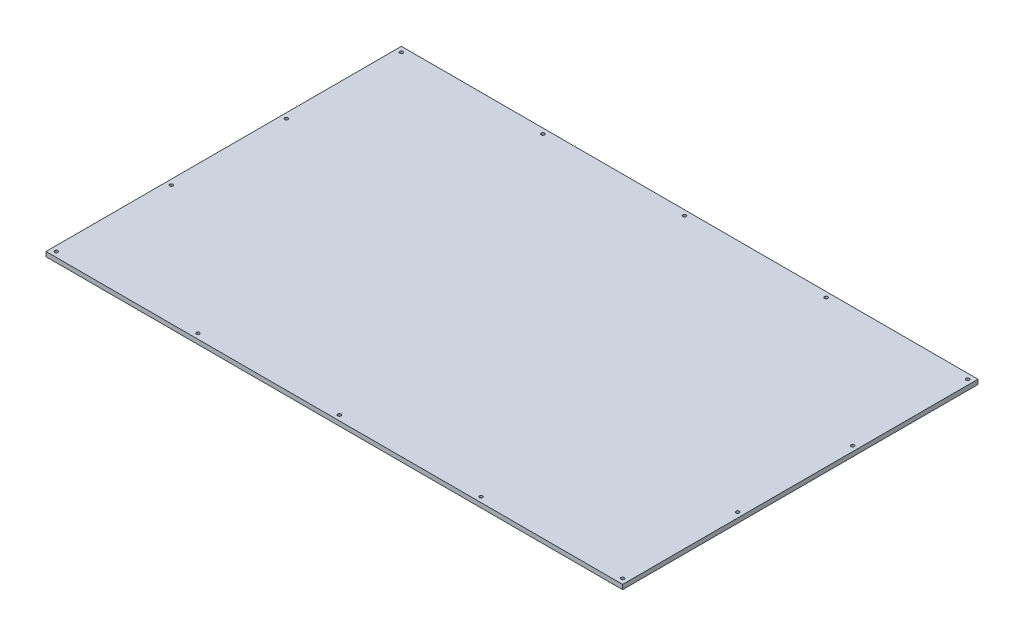
ISO-10303-21;
HEADER;
FILE_DESCRIPTION(('STEP AP214'),'2;1');
FILE_NAME('part.step','',(''),(''),'','','');
FILE_SCHEMA(('AUTOMOTIVE_DESIGN { 1 0 10303 214 1 1 1 1 }'));
ENDSEC;
DATA;
#1=APPLICATION_CONTEXT('core data for automotive mechanical design processes');
#2=APPLICATION_PROTOCOL_DEFINITION('international standard','automotive_design',2000,#1);
#3=PRODUCT_CONTEXT('',#1,'mechanical');
#4=PRODUCT('Part','Part','',(#3));
#5=PRODUCT_RELATED_PRODUCT_CATEGORY('part','',(#4));
#6=PRODUCT_DEFINITION_FORMATION('','',#4);
#7=PRODUCT_DEFINITION_CONTEXT('part definition',#1,'design');
#8=PRODUCT_DEFINITION('design','',#6,#7);
#9=PRODUCT_DEFINITION_SHAPE('','',#8);
#10=(LENGTH_UNIT() NAMED_UNIT(*) SI_UNIT(.MILLI.,.METRE.));
#11=(NAMED_UNIT(*) PLANE_ANGLE_UNIT() SI_UNIT($,.RADIAN.));
#12=(NAMED_UNIT(*) SI_UNIT($,.STERADIAN.) SOLID_ANGLE_UNIT());
#13=UNCERTAINTY_MEASURE_WITH_UNIT(LENGTH_MEASURE(1.E-05),#10,'distance_accuracy_value','');
#14=(GEOMETRIC_REPRESENTATION_CONTEXT(3) GLOBAL_UNCERTAINTY_ASSIGNED_CONTEXT((#13)) GLOBAL_UNIT_ASSIGNED_CONTEXT((#10,
#11,#12)) REPRESENTATION_CONTEXT('',''));
#15=CARTESIAN_POINT('',(0.,0.,0.));
#16=DIRECTION('',(0.,0.,1.));
#17=DIRECTION('',(1.,0.,0.));
#18=AXIS2_PLACEMENT_3D('',#15,#16,#17);
#19=CARTESIAN_POINT('',(3.07732182242956E-13,4.445,0.));
#20=DIRECTION('',(0.,1.,0.));
#21=DIRECTION('',(0.,0.,-1.));
#22=AXIS2_PLACEMENT_3D('',#19,#20,#21);
#23=PLANE('',#22);
#24=DIRECTION('',(0.,0.,-1.));
#25=VECTOR('',#24,1.);
#26=CARTESIAN_POINT('',(-399.256249999999,4.44499999999721,246.0625));
#27=LINE('',#26,#25);
#28=CARTESIAN_POINT('',(-399.256249999999,4.44499999999721,246.0625));
#29=VERTEX_POINT('',#28);
#30=CARTESIAN_POINT('',(-399.256249999999,4.44499999999721,-246.0625));
#31=VERTEX_POINT('',#30);
#32=EDGE_CURVE('E86',#29,#31,#27,.T.);
#33=ORIENTED_EDGE('',*,*,#32,.T.);
#34=DIRECTION('',(1.,0.,0.));
#35=VECTOR('',#34,1.);
#36=CARTESIAN_POINT('',(399.25625,4.44500000000279,-246.0625));
#37=LINE('',#36,#35);
#38=CARTESIAN_POINT('',(399.25625,4.44500000000279,-246.0625));
#39=VERTEX_POINT('',#38);
#40=EDGE_CURVE('E81',#31,#39,#37,.T.);
#41=ORIENTED_EDGE('',*,*,#40,.T.);
#42=DIRECTION('',(0.,0.,1.));
#43=VECTOR('',#42,1.);
#44=CARTESIAN_POINT('',(399.25625,4.44500000000279,246.0625));
#45=LINE('',#44,#43);
#46=CARTESIAN_POINT('',(399.25625,4.44500000000279,246.0625));
#47=VERTEX_POINT('',#46);
#48=EDGE_CURVE('E84',#39,#47,#45,.T.);
#49=ORIENTED_EDGE('',*,*,#48,.T.);
#50=DIRECTION('',(-1.,0.,0.));
#51=VECTOR('',#50,1.);
#52=CARTESIAN_POINT('',(399.25625,4.44500000000279,246.0625));
#53=LINE('',#52,#51);
#54=EDGE_CURVE('E51',#47,#29,#53,.T.);
#55=ORIENTED_EDGE('',*,*,#54,.T.);
#56=EDGE_LOOP('',(#33,#41,#49,#55));
#57=FACE_BOUND('',#56,.T.);
#58=CARTESIAN_POINT('',(196.056250000002,4.44500000000137,238.918749999995));
#59=DIRECTION('',(0.,-1.,0.));
#60=DIRECTION('',(0.,0.,1.));
#61=AXIS2_PLACEMENT_3D('',#58,#59,#60);
#62=CIRCLE('',#61,4.21640000000001);
#63=CARTESIAN_POINT('',(196.056250000002,4.44500000000137,243.135149999995));
#64=VERTEX_POINT('',#63);
#65=EDGE_CURVE('E114',#64,#64,#62,.T.);
#66=ORIENTED_EDGE('',*,*,#65,.F.);
#67=EDGE_LOOP('',(#66));
#68=FACE_BOUND('',#67,.T.);
#69=CARTESIAN_POINT('',(2.25062247533698E-12,4.445,238.918749999997));
#70=DIRECTION('',(0.,-1.,0.));
#71=DIRECTION('',(0.,0.,1.));
#72=AXIS2_PLACEMENT_3D('',#69,#70,#71);
#73=CIRCLE('',#72,4.2164);
#74=CARTESIAN_POINT('',(2.25062247533698E-12,4.445,243.135149999997));
#75=VERTEX_POINT('',#74);
#76=EDGE_CURVE('E119',#75,#75,#73,.T.);
#77=ORIENTED_EDGE('',*,*,#76,.F.);
#78=EDGE_LOOP('',(#77));
#79=FACE_BOUND('',#78,.T.);
#80=CARTESIAN_POINT('',(-196.056249999998,4.44499999999863,238.918749999998));
#81=DIRECTION('',(0.,-1.,0.));
#82=DIRECTION('',(0.,0.,1.));
#83=AXIS2_PLACEMENT_3D('',#80,#81,#82);
#84=CIRCLE('',#83,4.21640000000001);
#85=CARTESIAN_POINT('',(-196.056249999998,4.44499999999863,243.135149999999));
#86=VERTEX_POINT('',#85);
#87=EDGE_CURVE('E124',#86,#86,#84,.T.);
#88=ORIENTED_EDGE('',*,*,#87,.F.);
#89=EDGE_LOOP('',(#88));
#90=FACE_BOUND('',#89,.T.);
#91=CARTESIAN_POINT('',(-392.1125,4.44499999999726,-79.6395833333332));
#92=DIRECTION('',(0.,-1.,0.));
#93=DIRECTION('',(0.,0.,1.));
#94=AXIS2_PLACEMENT_3D('',#91,#92,#93);
#95=CIRCLE('',#94,4.21640000000001);
#96=CARTESIAN_POINT('',(-392.1125,4.44499999999726,-75.4231833333332));
#97=VERTEX_POINT('',#96);
#98=EDGE_CURVE('E129',#97,#97,#95,.T.);
#99=ORIENTED_EDGE('',*,*,#98,.F.);
#100=EDGE_LOOP('',(#99));
#101=FACE_BOUND('',#100,.T.);
#102=CARTESIAN_POINT('',(-392.1125,4.44499999999726,79.6395833333335));
#103=DIRECTION('',(0.,-1.,0.));
#104=DIRECTION('',(0.,0.,1.));
#105=AXIS2_PLACEMENT_3D('',#102,#103,#104);
#106=CIRCLE('',#105,4.21640000000001);
#107=CARTESIAN_POINT('',(-392.1125,4.44499999999726,83.8559833333335));
#108=VERTEX_POINT('',#107);
#109=EDGE_CURVE('E134',#108,#108,#106,.T.);
#110=ORIENTED_EDGE('',*,*,#109,.F.);
#111=EDGE_LOOP('',(#110));
#112=FACE_BOUND('',#111,.T.);
#113=CARTESIAN_POINT('',(392.1125,4.44500000000274,79.6395833333335));
#114=DIRECTION('',(0.,-1.,0.));
#115=DIRECTION('',(0.,0.,1.));
#116=AXIS2_PLACEMENT_3D('',#113,#114,#115);
#117=CIRCLE('',#116,4.21640000000001);
#118=CARTESIAN_POINT('',(392.1125,4.44500000000274,83.8559833333335));
#119=VERTEX_POINT('',#118);
#120=EDGE_CURVE('E139',#119,#119,#117,.T.);
#121=ORIENTED_EDGE('',*,*,#120,.F.);
#122=EDGE_LOOP('',(#121));
#123=FACE_BOUND('',#122,.T.);
#124=CARTESIAN_POINT('',(392.1125,4.44500000000274,-79.6395833333332));
#125=DIRECTION('',(0.,-1.,0.));
#126=DIRECTION('',(0.,0.,1.));
#127=AXIS2_PLACEMENT_3D('',#124,#125,#126);
#128=CIRCLE('',#127,4.21640000000001);
#129=CARTESIAN_POINT('',(392.1125,4.44500000000274,-75.4231833333332));
#130=VERTEX_POINT('',#129);
#131=EDGE_CURVE('E144',#130,#130,#128,.T.);
#132=ORIENTED_EDGE('',*,*,#131,.F.);
#133=EDGE_LOOP('',(#132));
#134=FACE_BOUND('',#133,.T.);
#135=CARTESIAN_POINT('',(-196.056249999999,4.44499999999863,-238.91875));
#136=DIRECTION('',(0.,-1.,0.));
#137=DIRECTION('',(0.,0.,1.));
#138=AXIS2_PLACEMENT_3D('',#135,#136,#137);
#139=CIRCLE('',#138,4.21640000000001);
#140=CARTESIAN_POINT('',(-196.056249999999,4.44499999999863,-234.70235));
#141=VERTEX_POINT('',#140);
#142=EDGE_CURVE('E149',#141,#141,#139,.T.);
#143=ORIENTED_EDGE('',*,*,#142,.F.);
#144=EDGE_LOOP('',(#143));
#145=FACE_BOUND('',#144,.T.);
#146=CARTESIAN_POINT('',(196.05625,4.44500000000137,-238.91875));
#147=DIRECTION('',(0.,-1.,0.));
#148=DIRECTION('',(0.,0.,1.));
#149=AXIS2_PLACEMENT_3D('',#146,#147,#148);
#150=CIRCLE('',#149,4.21640000000001);
#151=CARTESIAN_POINT('',(196.05625,4.44500000000137,-234.70235));
#152=VERTEX_POINT('',#151);
#153=EDGE_CURVE('E154',#152,#152,#150,.T.);
#154=ORIENTED_EDGE('',*,*,#153,.F.);
#155=EDGE_LOOP('',(#154));
#156=FACE_BOUND('',#155,.T.);
#157=CARTESIAN_POINT('',(3.63243333474214E-13,4.445,-238.91875));
#158=DIRECTION('',(0.,-1.,0.));
#159=DIRECTION('',(0.,0.,1.));
#160=AXIS2_PLACEMENT_3D('',#157,#158,#159);
#161=CIRCLE('',#160,4.2164);
#162=CARTESIAN_POINT('',(3.63243333474214E-13,4.445,-234.70235));
#163=VERTEX_POINT('',#162);
#164=EDGE_CURVE('E159',#163,#163,#161,.T.);
#165=ORIENTED_EDGE('',*,*,#164,.F.);
#166=EDGE_LOOP('',(#165));
#167=FACE_BOUND('',#166,.T.);
#168=CARTESIAN_POINT('',(-392.1125,4.44499999999726,238.91875));
#169=DIRECTION('',(0.,-1.,0.));
#170=DIRECTION('',(0.,0.,1.));
#171=AXIS2_PLACEMENT_3D('',#168,#169,#170);
#172=CIRCLE('',#171,4.21640000000001);
#173=CARTESIAN_POINT('',(-392.1125,4.44499999999726,243.13515));
#174=VERTEX_POINT('',#173);
#175=EDGE_CURVE('E163',#174,#174,#172,.T.);
#176=ORIENTED_EDGE('',*,*,#175,.F.);
#177=EDGE_LOOP('',(#176));
#178=FACE_BOUND('',#177,.T.);
#179=CARTESIAN_POINT('',(392.1125,4.44500000000274,-238.91875));
#180=DIRECTION('',(0.,-1.,0.));
#181=DIRECTION('',(0.,0.,1.));
#182=AXIS2_PLACEMENT_3D('',#179,#180,#181);
#183=CIRCLE('',#182,4.21640000000001);
#184=CARTESIAN_POINT('',(392.1125,4.44500000000274,-234.70235));
#185=VERTEX_POINT('',#184);
#186=EDGE_CURVE('E167',#185,#185,#183,.T.);
#187=ORIENTED_EDGE('',*,*,#186,.F.);
#188=EDGE_LOOP('',(#187));
#189=FACE_BOUND('',#188,.T.);
#190=CARTESIAN_POINT('',(392.1125,4.44500000000274,238.91875));
#191=DIRECTION('',(0.,-1.,0.));
#192=DIRECTION('',(0.,0.,1.));
#193=AXIS2_PLACEMENT_3D('',#190,#191,#192);
#194=CIRCLE('',#193,4.21640000000001);
#195=CARTESIAN_POINT('',(392.1125,4.44500000000274,243.13515));
#196=VERTEX_POINT('',#195);
#197=EDGE_CURVE('E174',#196,#196,#194,.T.);
#198=ORIENTED_EDGE('',*,*,#197,.F.);
#199=EDGE_LOOP('',(#198));
#200=FACE_BOUND('',#199,.T.);
#201=CARTESIAN_POINT('',(-392.1125,4.44499999999726,-238.91875));
#202=DIRECTION('',(0.,-1.,0.));
#203=DIRECTION('',(0.,0.,1.));
#204=AXIS2_PLACEMENT_3D('',#201,#202,#203);
#205=CIRCLE('',#204,4.21640000000001);
#206=CARTESIAN_POINT('',(-392.1125,4.44499999999726,-234.70235));
#207=VERTEX_POINT('',#206);
#208=EDGE_CURVE('E266',#207,#207,#205,.T.);
#209=ORIENTED_EDGE('',*,*,#208,.F.);
#210=EDGE_LOOP('',(#209));
#211=FACE_BOUND('',#210,.T.);
#212=ADVANCED_FACE('F32',(#57,#68,#79,#90,#101,#112,#123,#134,#145,#156,#167,#178,#189,#200,
#211),#23,.F.);
#213=CARTESIAN_POINT('',(-399.256249999999,4.44499999999721,246.0625));
#214=DIRECTION('',(1.,0.,0.));
#215=DIRECTION('',(0.,0.,1.));
#216=AXIS2_PLACEMENT_3D('',#213,#214,#215);
#217=PLANE('',#216);
#218=DIRECTION('',(0.,0.,-1.));
#219=VECTOR('',#218,1.);
#220=CARTESIAN_POINT('',(-399.256249999999,10.7949999999972,246.0625));
#221=LINE('',#220,#219);
#222=CARTESIAN_POINT('',(-399.256249999999,10.7949999999972,246.0625));
#223=VERTEX_POINT('',#222);
#224=CARTESIAN_POINT('',(-399.256249999999,10.7949999999972,-246.0625));
#225=VERTEX_POINT('',#224);
#226=EDGE_CURVE('E99',#223,#225,#221,.T.);
#227=ORIENTED_EDGE('',*,*,#226,.T.);
#228=DIRECTION('',(0.,1.,0.));
#229=VECTOR('',#228,1.);
#230=CARTESIAN_POINT('',(-399.256249999999,4.44499999999721,-246.0625));
#231=LINE('',#230,#229);
#232=EDGE_CURVE('E11',#31,#225,#231,.T.);
#233=ORIENTED_EDGE('',*,*,#232,.F.);
#234=ORIENTED_EDGE('',*,*,#32,.F.);
#235=DIRECTION('',(0.,1.,0.));
#236=VECTOR('',#235,1.);
#237=CARTESIAN_POINT('',(-399.256249999999,4.44499999999721,246.0625));
#238=LINE('',#237,#236);
#239=EDGE_CURVE('E95',#29,#223,#238,.T.);
#240=ORIENTED_EDGE('',*,*,#239,.T.);
#241=EDGE_LOOP('',(#227,#233,#234,#240));
#242=FACE_BOUND('',#241,.T.);
#243=ADVANCED_FACE('F34',(#242),#217,.F.);
#244=CARTESIAN_POINT('',(399.25625,4.44500000000279,-246.0625));
#245=DIRECTION('',(0.,0.,1.));
#246=DIRECTION('',(-1.,0.,0.));
#247=AXIS2_PLACEMENT_3D('',#244,#245,#246);
#248=PLANE('',#247);
#249=DIRECTION('',(1.,0.,0.));
#250=VECTOR('',#249,1.);
#251=CARTESIAN_POINT('',(399.25625,10.7950000000028,-246.0625));
#252=LINE('',#251,#250);
#253=CARTESIAN_POINT('',(399.25625,10.7950000000028,-246.0625));
#254=VERTEX_POINT('',#253);
#255=EDGE_CURVE('E90',#225,#254,#252,.T.);
#256=ORIENTED_EDGE('',*,*,#255,.T.);
#257=DIRECTION('',(0.,1.,0.));
#258=VECTOR('',#257,1.);
#259=CARTESIAN_POINT('',(399.25625,4.44500000000279,-246.0625));
#260=LINE('',#259,#258);
#261=EDGE_CURVE('E42',#39,#254,#260,.T.);
#262=ORIENTED_EDGE('',*,*,#261,.F.);
#263=ORIENTED_EDGE('',*,*,#40,.F.);
#264=ORIENTED_EDGE('',*,*,#232,.T.);
#265=EDGE_LOOP('',(#256,#262,#263,#264));
#266=FACE_BOUND('',#265,.T.);
#267=ADVANCED_FACE('F89',(#266),#248,.F.);
#268=CARTESIAN_POINT('',(399.25625,4.44500000000279,246.0625));
#269=DIRECTION('',(-1.,0.,0.));
#270=DIRECTION('',(0.,0.,-1.));
#271=AXIS2_PLACEMENT_3D('',#268,#269,#270);
#272=PLANE('',#271);
#273=DIRECTION('',(0.,0.,1.));
#274=VECTOR('',#273,1.);
#275=CARTESIAN_POINT('',(399.25625,10.7950000000028,246.0625));
#276=LINE('',#275,#274);
#277=CARTESIAN_POINT('',(399.25625,10.7950000000028,246.0625));
#278=VERTEX_POINT('',#277);
#279=EDGE_CURVE('E68',#254,#278,#276,.T.);
#280=ORIENTED_EDGE('',*,*,#279,.T.);
#281=DIRECTION('',(0.,1.,0.));
#282=VECTOR('',#281,1.);
#283=CARTESIAN_POINT('',(399.25625,4.44500000000279,246.0625));
#284=LINE('',#283,#282);
#285=EDGE_CURVE('E91',#47,#278,#284,.T.);
#286=ORIENTED_EDGE('',*,*,#285,.F.);
#287=ORIENTED_EDGE('',*,*,#48,.F.);
#288=ORIENTED_EDGE('',*,*,#261,.T.);
#289=EDGE_LOOP('',(#280,#286,#287,#288));
#290=FACE_BOUND('',#289,.T.);
#291=ADVANCED_FACE('F93',(#290),#272,.F.);
#292=CARTESIAN_POINT('',(399.25625,4.44500000000279,246.0625));
#293=DIRECTION('',(0.,0.,-1.));
#294=DIRECTION('',(1.,0.,0.));
#295=AXIS2_PLACEMENT_3D('',#292,#293,#294);
#296=PLANE('',#295);
#297=DIRECTION('',(-1.,0.,0.));
#298=VECTOR('',#297,1.);
#299=CARTESIAN_POINT('',(399.25625,10.7950000000028,246.0625));
#300=LINE('',#299,#298);
#301=EDGE_CURVE('E74',#278,#223,#300,.T.);
#302=ORIENTED_EDGE('',*,*,#301,.T.);
#303=ORIENTED_EDGE('',*,*,#239,.F.);
#304=ORIENTED_EDGE('',*,*,#54,.F.);
#305=ORIENTED_EDGE('',*,*,#285,.T.);
#306=EDGE_LOOP('',(#302,#303,#304,#305));
#307=FACE_BOUND('',#306,.T.);
#308=ADVANCED_FACE('F281',(#307),#296,.F.);
#309=CARTESIAN_POINT('',(2.63390369239648E-13,10.795,0.));
#310=DIRECTION('',(0.,1.,0.));
#311=DIRECTION('',(0.,0.,-1.));
#312=AXIS2_PLACEMENT_3D('',#309,#310,#311);
#313=PLANE('',#312);
#314=CARTESIAN_POINT('',(-392.1125,10.7949999999973,-238.91875));
#315=DIRECTION('',(0.,1.,0.));
#316=DIRECTION('',(0.,0.,-1.));
#317=AXIS2_PLACEMENT_3D('',#314,#315,#316);
#318=CIRCLE('',#317,2.2479);
#319=CARTESIAN_POINT('',(-392.1125,10.7949999999973,-241.16665));
#320=VERTEX_POINT('',#319);
#321=EDGE_CURVE('E36',#320,#320,#318,.T.);
#322=ORIENTED_EDGE('',*,*,#321,.F.);
#323=EDGE_LOOP('',(#322));
#324=FACE_BOUND('',#323,.T.);
#325=CARTESIAN_POINT('',(392.1125,10.7950000000027,238.91875));
#326=DIRECTION('',(0.,1.,0.));
#327=DIRECTION('',(0.,0.,-1.));
#328=AXIS2_PLACEMENT_3D('',#325,#326,#327);
#329=CIRCLE('',#328,2.2479);
#330=CARTESIAN_POINT('',(392.1125,10.7950000000027,236.67085));
#331=VERTEX_POINT('',#330);
#332=EDGE_CURVE('E165',#331,#331,#329,.T.);
#333=ORIENTED_EDGE('',*,*,#332,.F.);
#334=EDGE_LOOP('',(#333));
#335=FACE_BOUND('',#334,.T.);
#336=CARTESIAN_POINT('',(392.1125,10.7950000000027,-238.91875));
#337=DIRECTION('',(0.,1.,0.));
#338=DIRECTION('',(0.,0.,-1.));
#339=AXIS2_PLACEMENT_3D('',#336,#337,#338);
#340=CIRCLE('',#339,2.2479);
#341=CARTESIAN_POINT('',(392.1125,10.7950000000027,-241.16665));
#342=VERTEX_POINT('',#341);
#343=EDGE_CURVE('E161',#342,#342,#340,.T.);
#344=ORIENTED_EDGE('',*,*,#343,.F.);
#345=EDGE_LOOP('',(#344));
#346=FACE_BOUND('',#345,.T.);
#347=CARTESIAN_POINT('',(-392.1125,10.7949999999973,238.91875));
#348=DIRECTION('',(0.,1.,0.));
#349=DIRECTION('',(0.,0.,-1.));
#350=AXIS2_PLACEMENT_3D('',#347,#348,#349);
#351=CIRCLE('',#350,2.2479);
#352=CARTESIAN_POINT('',(-392.1125,10.7949999999973,236.67085));
#353=VERTEX_POINT('',#352);
#354=EDGE_CURVE('E156',#353,#353,#351,.T.);
#355=ORIENTED_EDGE('',*,*,#354,.F.);
#356=EDGE_LOOP('',(#355));
#357=FACE_BOUND('',#356,.T.);
#358=CARTESIAN_POINT('',(3.18901520470906E-13,10.795,-238.91875));
#359=DIRECTION('',(0.,1.,0.));
#360=DIRECTION('',(0.,0.,-1.));
#361=AXIS2_PLACEMENT_3D('',#358,#359,#360);
#362=CIRCLE('',#361,2.2479);
#363=CARTESIAN_POINT('',(3.18901520470906E-13,10.795,-241.16665));
#364=VERTEX_POINT('',#363);
#365=EDGE_CURVE('E151',#364,#364,#362,.T.);
#366=ORIENTED_EDGE('',*,*,#365,.F.);
#367=EDGE_LOOP('',(#366));
#368=FACE_BOUND('',#367,.T.);
#369=CARTESIAN_POINT('',(196.05625,10.7950000000014,-238.91875));
#370=DIRECTION('',(0.,1.,0.));
#371=DIRECTION('',(0.,0.,-1.));
#372=AXIS2_PLACEMENT_3D('',#369,#370,#371);
#373=CIRCLE('',#372,2.2479);
#374=CARTESIAN_POINT('',(196.05625,10.7950000000014,-241.16665));
#375=VERTEX_POINT('',#374);
#376=EDGE_CURVE('E146',#375,#375,#373,.T.);
#377=ORIENTED_EDGE('',*,*,#376,.F.);
#378=EDGE_LOOP('',(#377));
#379=FACE_BOUND('',#378,.T.);
#380=CARTESIAN_POINT('',(-196.056249999999,10.7949999999986,-238.91875));
#381=DIRECTION('',(0.,1.,0.));
#382=DIRECTION('',(0.,0.,-1.));
#383=AXIS2_PLACEMENT_3D('',#380,#381,#382);
#384=CIRCLE('',#383,2.2479);
#385=CARTESIAN_POINT('',(-196.056249999999,10.7949999999986,-241.16665));
#386=VERTEX_POINT('',#385);
#387=EDGE_CURVE('E141',#386,#386,#384,.T.);
#388=ORIENTED_EDGE('',*,*,#387,.F.);
#389=EDGE_LOOP('',(#388));
#390=FACE_BOUND('',#389,.T.);
#391=CARTESIAN_POINT('',(392.1125,10.7950000000027,-79.6395833333332));
#392=DIRECTION('',(0.,1.,0.));
#393=DIRECTION('',(0.,0.,-1.));
#394=AXIS2_PLACEMENT_3D('',#391,#392,#393);
#395=CIRCLE('',#394,2.2479);
#396=CARTESIAN_POINT('',(392.1125,10.7950000000027,-81.8874833333333));
#397=VERTEX_POINT('',#396);
#398=EDGE_CURVE('E136',#397,#397,#395,.T.);
#399=ORIENTED_EDGE('',*,*,#398,.F.);
#400=EDGE_LOOP('',(#399));
#401=FACE_BOUND('',#400,.T.);
#402=CARTESIAN_POINT('',(392.1125,10.7950000000027,79.6395833333335));
#403=DIRECTION('',(0.,1.,0.));
#404=DIRECTION('',(0.,0.,-1.));
#405=AXIS2_PLACEMENT_3D('',#402,#403,#404);
#406=CIRCLE('',#405,2.2479);
#407=CARTESIAN_POINT('',(392.1125,10.7950000000027,77.3916833333335));
#408=VERTEX_POINT('',#407);
#409=EDGE_CURVE('E131',#408,#408,#406,.T.);
#410=ORIENTED_EDGE('',*,*,#409,.F.);
#411=EDGE_LOOP('',(#410));
#412=FACE_BOUND('',#411,.T.);
#413=CARTESIAN_POINT('',(-392.1125,10.7949999999973,79.6395833333335));
#414=DIRECTION('',(0.,1.,0.));
#415=DIRECTION('',(0.,0.,-1.));
#416=AXIS2_PLACEMENT_3D('',#413,#414,#415);
#417=CIRCLE('',#416,2.2479);
#418=CARTESIAN_POINT('',(-392.1125,10.7949999999973,77.3916833333335));
#419=VERTEX_POINT('',#418);
#420=EDGE_CURVE('E126',#419,#419,#417,.T.);
#421=ORIENTED_EDGE('',*,*,#420,.F.);
#422=EDGE_LOOP('',(#421));
#423=FACE_BOUND('',#422,.T.);
#424=CARTESIAN_POINT('',(-392.1125,10.7949999999973,-79.6395833333332));
#425=DIRECTION('',(0.,1.,0.));
#426=DIRECTION('',(0.,0.,-1.));
#427=AXIS2_PLACEMENT_3D('',#424,#425,#426);
#428=CIRCLE('',#427,2.2479);
#429=CARTESIAN_POINT('',(-392.1125,10.7949999999973,-81.8874833333333));
#430=VERTEX_POINT('',#429);
#431=EDGE_CURVE('E121',#430,#430,#428,.T.);
#432=ORIENTED_EDGE('',*,*,#431,.F.);
#433=EDGE_LOOP('',(#432));
#434=FACE_BOUND('',#433,.T.);
#435=CARTESIAN_POINT('',(-196.056249999998,10.7949999999986,238.918749999998));
#436=DIRECTION('',(0.,1.,0.));
#437=DIRECTION('',(0.,0.,-1.));
#438=AXIS2_PLACEMENT_3D('',#435,#436,#437);
#439=CIRCLE('',#438,2.2479);
#440=CARTESIAN_POINT('',(-196.056249999998,10.7949999999986,236.670849999998));
#441=VERTEX_POINT('',#440);
#442=EDGE_CURVE('E116',#441,#441,#439,.T.);
#443=ORIENTED_EDGE('',*,*,#442,.F.);
#444=EDGE_LOOP('',(#443));
#445=FACE_BOUND('',#444,.T.);
#446=CARTESIAN_POINT('',(2.20628066233367E-12,10.795,238.918749999997));
#447=DIRECTION('',(0.,1.,0.));
#448=DIRECTION('',(0.,0.,-1.));
#449=AXIS2_PLACEMENT_3D('',#446,#447,#448);
#450=CIRCLE('',#449,2.2479);
#451=CARTESIAN_POINT('',(2.20628066233367E-12,10.795,236.670849999997));
#452=VERTEX_POINT('',#451);
#453=EDGE_CURVE('E111',#452,#452,#450,.T.);
#454=ORIENTED_EDGE('',*,*,#453,.F.);
#455=EDGE_LOOP('',(#454));
#456=FACE_BOUND('',#455,.T.);
#457=CARTESIAN_POINT('',(196.056250000002,10.7950000000014,238.918749999995));
#458=DIRECTION('',(0.,1.,0.));
#459=DIRECTION('',(0.,0.,-1.));
#460=AXIS2_PLACEMENT_3D('',#457,#458,#459);
#461=CIRCLE('',#460,2.2479);
#462=CARTESIAN_POINT('',(196.056250000002,10.7950000000014,236.670849999995));
#463=VERTEX_POINT('',#462);
#464=EDGE_CURVE('E102',#463,#463,#461,.T.);
#465=ORIENTED_EDGE('',*,*,#464,.F.);
#466=EDGE_LOOP('',(#465));
#467=FACE_BOUND('',#466,.T.);
#468=ORIENTED_EDGE('',*,*,#226,.F.);
#469=ORIENTED_EDGE('',*,*,#301,.F.);
#470=ORIENTED_EDGE('',*,*,#279,.F.);
#471=ORIENTED_EDGE('',*,*,#255,.F.);
#472=EDGE_LOOP('',(#468,#469,#470,#471));
#473=FACE_BOUND('',#472,.T.);
#474=ADVANCED_FACE('F278',(#324,#335,#346,#357,#368,#379,#390,#401,#412,#423,#434,#445,#456,
#467,#473),#313,.T.);
#475=CARTESIAN_POINT('',(196.056250000002,4.44500000000137,238.918749999995));
#476=DIRECTION('',(0.,-1.,0.));
#477=DIRECTION('',(0.,0.,1.));
#478=AXIS2_PLACEMENT_3D('',#475,#476,#477);
#479=CYLINDRICAL_SURFACE('',#478,2.2479);
#480=ORIENTED_EDGE('',*,*,#464,.T.);
#481=EDGE_LOOP('',(#480));
#482=FACE_BOUND('',#481,.T.);
#483=CARTESIAN_POINT('',(196.056250000002,6.09676762397385,238.918749999995));
#484=DIRECTION('',(0.,-1.,0.));
#485=DIRECTION('',(0.,0.,1.));
#486=AXIS2_PLACEMENT_3D('',#483,#484,#485);
#487=CIRCLE('',#486,2.2479);
#488=CARTESIAN_POINT('',(196.056250000002,6.09676762397385,241.166649999995));
#489=VERTEX_POINT('',#488);
#490=EDGE_CURVE('E110',#489,#489,#487,.T.);
#491=ORIENTED_EDGE('',*,*,#490,.T.);
#492=EDGE_LOOP('',(#491));
#493=FACE_BOUND('',#492,.T.);
#494=ADVANCED_FACE('F229',(#482,#493),#479,.F.);
#495=CARTESIAN_POINT('',(196.056250000002,4.44500000000137,238.918749999995));
#496=DIRECTION('',(0.,-1.,0.));
#497=DIRECTION('',(0.,0.,1.));
#498=AXIS2_PLACEMENT_3D('',#495,#496,#497);
#499=CONICAL_SURFACE('',#498,4.21640000000001,0.872664625997168);
#500=ORIENTED_EDGE('',*,*,#490,.F.);
#501=EDGE_LOOP('',(#500));
#502=FACE_BOUND('',#501,.T.);
#503=ORIENTED_EDGE('',*,*,#65,.T.);
#504=EDGE_LOOP('',(#503));
#505=FACE_BOUND('',#504,.T.);
#506=ADVANCED_FACE('F231',(#502,#505),#499,.F.);
#507=CARTESIAN_POINT('',(2.25062247533698E-12,4.445,238.918749999997));
#508=DIRECTION('',(0.,-1.,0.));
#509=DIRECTION('',(0.,0.,1.));
#510=AXIS2_PLACEMENT_3D('',#507,#508,#509);
#511=CYLINDRICAL_SURFACE('',#510,2.2479);
#512=ORIENTED_EDGE('',*,*,#453,.T.);
#513=EDGE_LOOP('',(#512));
#514=FACE_BOUND('',#513,.T.);
#515=CARTESIAN_POINT('',(2.23908824366657E-12,6.09676762397248,238.918749999997));
#516=DIRECTION('',(0.,-1.,0.));
#517=DIRECTION('',(0.,0.,1.));
#518=AXIS2_PLACEMENT_3D('',#515,#516,#517);
#519=CIRCLE('',#518,2.2479);
#520=CARTESIAN_POINT('',(2.23908824366657E-12,6.09676762397248,241.166649999997));
#521=VERTEX_POINT('',#520);
#522=EDGE_CURVE('E115',#521,#521,#519,.T.);
#523=ORIENTED_EDGE('',*,*,#522,.T.);
#524=EDGE_LOOP('',(#523));
#525=FACE_BOUND('',#524,.T.);
#526=ADVANCED_FACE('F234',(#514,#525),#511,.F.);
#527=CARTESIAN_POINT('',(2.25062247533698E-12,4.445,238.918749999997));
#528=DIRECTION('',(0.,-1.,0.));
#529=DIRECTION('',(0.,0.,1.));
#530=AXIS2_PLACEMENT_3D('',#527,#528,#529);
#531=CONICAL_SURFACE('',#530,4.2164,0.872664625997165);
#532=ORIENTED_EDGE('',*,*,#522,.F.);
#533=EDGE_LOOP('',(#532));
#534=FACE_BOUND('',#533,.T.);
#535=ORIENTED_EDGE('',*,*,#76,.T.);
#536=EDGE_LOOP('',(#535));
#537=FACE_BOUND('',#536,.T.);
#538=ADVANCED_FACE('F366',(#534,#537),#531,.F.);
#539=CARTESIAN_POINT('',(-196.056249999998,4.44499999999863,238.918749999998));
#540=DIRECTION('',(0.,-1.,0.));
#541=DIRECTION('',(0.,0.,1.));
#542=AXIS2_PLACEMENT_3D('',#539,#540,#541);
#543=CYLINDRICAL_SURFACE('',#542,2.2479);
#544=ORIENTED_EDGE('',*,*,#442,.T.);
#545=EDGE_LOOP('',(#544));
#546=FACE_BOUND('',#545,.T.);
#547=CARTESIAN_POINT('',(-196.056249999998,6.09676762397111,238.918749999998));
#548=DIRECTION('',(0.,-1.,0.));
#549=DIRECTION('',(0.,0.,1.));
#550=AXIS2_PLACEMENT_3D('',#547,#548,#549);
#551=CIRCLE('',#550,2.2479);
#552=CARTESIAN_POINT('',(-196.056249999998,6.09676762397111,241.166649999998));
#553=VERTEX_POINT('',#552);
#554=EDGE_CURVE('E120',#553,#553,#551,.T.);
#555=ORIENTED_EDGE('',*,*,#554,.T.);
#556=EDGE_LOOP('',(#555));
#557=FACE_BOUND('',#556,.T.);
#558=ADVANCED_FACE('F375',(#546,#557),#543,.F.);
#559=CARTESIAN_POINT('',(-196.056249999998,4.44499999999863,238.918749999998));
#560=DIRECTION('',(0.,-1.,0.));
#561=DIRECTION('',(0.,0.,1.));
#562=AXIS2_PLACEMENT_3D('',#559,#560,#561);
#563=CONICAL_SURFACE('',#562,4.21640000000001,0.872664625997168);
#564=ORIENTED_EDGE('',*,*,#554,.F.);
#565=EDGE_LOOP('',(#564));
#566=FACE_BOUND('',#565,.T.);
#567=ORIENTED_EDGE('',*,*,#87,.T.);
#568=EDGE_LOOP('',(#567));
#569=FACE_BOUND('',#568,.T.);
#570=ADVANCED_FACE('F384',(#566,#569),#563,.F.);
#571=CARTESIAN_POINT('',(-392.1125,4.44499999999726,-79.6395833333332));
#572=DIRECTION('',(0.,-1.,0.));
#573=DIRECTION('',(0.,0.,1.));
#574=AXIS2_PLACEMENT_3D('',#571,#572,#573);
#575=CYLINDRICAL_SURFACE('',#574,2.2479);
#576=ORIENTED_EDGE('',*,*,#431,.T.);
#577=EDGE_LOOP('',(#576));
#578=FACE_BOUND('',#577,.T.);
#579=CARTESIAN_POINT('',(-392.1125,6.09676762396974,-79.6395833333332));
#580=DIRECTION('',(0.,-1.,0.));
#581=DIRECTION('',(0.,0.,1.));
#582=AXIS2_PLACEMENT_3D('',#579,#580,#581);
#583=CIRCLE('',#582,2.24790000000002);
#584=CARTESIAN_POINT('',(-392.1125,6.09676762396974,-77.3916833333332));
#585=VERTEX_POINT('',#584);
#586=EDGE_CURVE('E125',#585,#585,#583,.T.);
#587=ORIENTED_EDGE('',*,*,#586,.T.);
#588=EDGE_LOOP('',(#587));
#589=FACE_BOUND('',#588,.T.);
#590=ADVANCED_FACE('F393',(#578,#589),#575,.F.);
#591=CARTESIAN_POINT('',(-392.1125,4.44499999999726,-79.6395833333332));
#592=DIRECTION('',(0.,-1.,0.));
#593=DIRECTION('',(0.,0.,1.));
#594=AXIS2_PLACEMENT_3D('',#591,#592,#593);
#595=CONICAL_SURFACE('',#594,4.21640000000001,0.872664625997161);
#596=ORIENTED_EDGE('',*,*,#586,.F.);
#597=EDGE_LOOP('',(#596));
#598=FACE_BOUND('',#597,.T.);
#599=ORIENTED_EDGE('',*,*,#98,.T.);
#600=EDGE_LOOP('',(#599));
#601=FACE_BOUND('',#600,.T.);
#602=ADVANCED_FACE('F402',(#598,#601),#595,.F.);
#603=CARTESIAN_POINT('',(-392.1125,4.44499999999726,79.6395833333335));
#604=DIRECTION('',(0.,-1.,0.));
#605=DIRECTION('',(0.,0.,1.));
#606=AXIS2_PLACEMENT_3D('',#603,#604,#605);
#607=CYLINDRICAL_SURFACE('',#606,2.2479);
#608=ORIENTED_EDGE('',*,*,#420,.T.);
#609=EDGE_LOOP('',(#608));
#610=FACE_BOUND('',#609,.T.);
#611=CARTESIAN_POINT('',(-392.1125,6.09676762396974,79.6395833333335));
#612=DIRECTION('',(0.,-1.,0.));
#613=DIRECTION('',(0.,0.,1.));
#614=AXIS2_PLACEMENT_3D('',#611,#612,#613);
#615=CIRCLE('',#614,2.24790000000002);
#616=CARTESIAN_POINT('',(-392.1125,6.09676762396974,81.8874833333335));
#617=VERTEX_POINT('',#616);
#618=EDGE_CURVE('E130',#617,#617,#615,.T.);
#619=ORIENTED_EDGE('',*,*,#618,.T.);
#620=EDGE_LOOP('',(#619));
#621=FACE_BOUND('',#620,.T.);
#622=ADVANCED_FACE('F411',(#610,#621),#607,.F.);
#623=CARTESIAN_POINT('',(-392.1125,4.44499999999726,79.6395833333335));
#624=DIRECTION('',(0.,-1.,0.));
#625=DIRECTION('',(0.,0.,1.));
#626=AXIS2_PLACEMENT_3D('',#623,#624,#625);
#627=CONICAL_SURFACE('',#626,4.21640000000001,0.872664625997161);
#628=ORIENTED_EDGE('',*,*,#618,.F.);
#629=EDGE_LOOP('',(#628));
#630=FACE_BOUND('',#629,.T.);
#631=ORIENTED_EDGE('',*,*,#109,.T.);
#632=EDGE_LOOP('',(#631));
#633=FACE_BOUND('',#632,.T.);
#634=ADVANCED_FACE('F420',(#630,#633),#627,.F.);
#635=CARTESIAN_POINT('',(392.1125,4.44500000000274,79.6395833333335));
#636=DIRECTION('',(0.,-1.,0.));
#637=DIRECTION('',(0.,0.,1.));
#638=AXIS2_PLACEMENT_3D('',#635,#636,#637);
#639=CYLINDRICAL_SURFACE('',#638,2.2479);
#640=ORIENTED_EDGE('',*,*,#409,.T.);
#641=EDGE_LOOP('',(#640));
#642=FACE_BOUND('',#641,.T.);
#643=CARTESIAN_POINT('',(392.1125,6.09676762397521,79.6395833333335));
#644=DIRECTION('',(0.,-1.,0.));
#645=DIRECTION('',(0.,0.,1.));
#646=AXIS2_PLACEMENT_3D('',#643,#644,#645);
#647=CIRCLE('',#646,2.24790000000002);
#648=CARTESIAN_POINT('',(392.1125,6.09676762397521,81.8874833333335));
#649=VERTEX_POINT('',#648);
#650=EDGE_CURVE('E135',#649,#649,#647,.T.);
#651=ORIENTED_EDGE('',*,*,#650,.T.);
#652=EDGE_LOOP('',(#651));
#653=FACE_BOUND('',#652,.T.);
#654=ADVANCED_FACE('F429',(#642,#653),#639,.F.);
#655=CARTESIAN_POINT('',(392.1125,4.44500000000274,79.6395833333335));
#656=DIRECTION('',(0.,-1.,0.));
#657=DIRECTION('',(0.,0.,1.));
#658=AXIS2_PLACEMENT_3D('',#655,#656,#657);
#659=CONICAL_SURFACE('',#658,4.21640000000001,0.872664625997161);
#660=ORIENTED_EDGE('',*,*,#650,.F.);
#661=EDGE_LOOP('',(#660));
#662=FACE_BOUND('',#661,.T.);
#663=ORIENTED_EDGE('',*,*,#120,.T.);
#664=EDGE_LOOP('',(#663));
#665=FACE_BOUND('',#664,.T.);
#666=ADVANCED_FACE('F438',(#662,#665),#659,.F.);
#667=CARTESIAN_POINT('',(392.1125,4.44500000000274,-79.6395833333332));
#668=DIRECTION('',(0.,-1.,0.));
#669=DIRECTION('',(0.,0.,1.));
#670=AXIS2_PLACEMENT_3D('',#667,#668,#669);
#671=CYLINDRICAL_SURFACE('',#670,2.2479);
#672=ORIENTED_EDGE('',*,*,#398,.T.);
#673=EDGE_LOOP('',(#672));
#674=FACE_BOUND('',#673,.T.);
#675=CARTESIAN_POINT('',(392.1125,6.09676762397521,-79.6395833333332));
#676=DIRECTION('',(0.,-1.,0.));
#677=DIRECTION('',(0.,0.,1.));
#678=AXIS2_PLACEMENT_3D('',#675,#676,#677);
#679=CIRCLE('',#678,2.24790000000002);
#680=CARTESIAN_POINT('',(392.1125,6.09676762397521,-77.3916833333332));
#681=VERTEX_POINT('',#680);
#682=EDGE_CURVE('E140',#681,#681,#679,.T.);
#683=ORIENTED_EDGE('',*,*,#682,.T.);
#684=EDGE_LOOP('',(#683));
#685=FACE_BOUND('',#684,.T.);
#686=ADVANCED_FACE('F447',(#674,#685),#671,.F.);
#687=CARTESIAN_POINT('',(392.1125,4.44500000000274,-79.6395833333332));
#688=DIRECTION('',(0.,-1.,0.));
#689=DIRECTION('',(0.,0.,1.));
#690=AXIS2_PLACEMENT_3D('',#687,#688,#689);
#691=CONICAL_SURFACE('',#690,4.21640000000001,0.872664625997161);
#692=ORIENTED_EDGE('',*,*,#682,.F.);
#693=EDGE_LOOP('',(#692));
#694=FACE_BOUND('',#693,.T.);
#695=ORIENTED_EDGE('',*,*,#131,.T.);
#696=EDGE_LOOP('',(#695));
#697=FACE_BOUND('',#696,.T.);
#698=ADVANCED_FACE('F456',(#694,#697),#691,.F.);
#699=CARTESIAN_POINT('',(-196.056249999999,4.44499999999863,-238.91875));
#700=DIRECTION('',(0.,-1.,0.));
#701=DIRECTION('',(0.,0.,1.));
#702=AXIS2_PLACEMENT_3D('',#699,#700,#701);
#703=CYLINDRICAL_SURFACE('',#702,2.2479);
#704=ORIENTED_EDGE('',*,*,#387,.T.);
#705=EDGE_LOOP('',(#704));
#706=FACE_BOUND('',#705,.T.);
#707=CARTESIAN_POINT('',(-196.056249999999,6.09676762397111,-238.91875));
#708=DIRECTION('',(0.,-1.,0.));
#709=DIRECTION('',(0.,0.,1.));
#710=AXIS2_PLACEMENT_3D('',#707,#708,#709);
#711=CIRCLE('',#710,2.2479);
#712=CARTESIAN_POINT('',(-196.056249999999,6.09676762397111,-236.67085));
#713=VERTEX_POINT('',#712);
#714=EDGE_CURVE('E145',#713,#713,#711,.T.);
#715=ORIENTED_EDGE('',*,*,#714,.T.);
#716=EDGE_LOOP('',(#715));
#717=FACE_BOUND('',#716,.T.);
#718=ADVANCED_FACE('F465',(#706,#717),#703,.F.);
#719=CARTESIAN_POINT('',(-196.056249999999,4.44499999999863,-238.91875));
#720=DIRECTION('',(0.,-1.,0.));
#721=DIRECTION('',(0.,0.,1.));
#722=AXIS2_PLACEMENT_3D('',#719,#720,#721);
#723=CONICAL_SURFACE('',#722,4.21640000000001,0.872664625997168);
#724=ORIENTED_EDGE('',*,*,#714,.F.);
#725=EDGE_LOOP('',(#724));
#726=FACE_BOUND('',#725,.T.);
#727=ORIENTED_EDGE('',*,*,#142,.T.);
#728=EDGE_LOOP('',(#727));
#729=FACE_BOUND('',#728,.T.);
#730=ADVANCED_FACE('F474',(#726,#729),#723,.F.);
#731=CARTESIAN_POINT('',(196.05625,4.44500000000137,-238.91875));
#732=DIRECTION('',(0.,-1.,0.));
#733=DIRECTION('',(0.,0.,1.));
#734=AXIS2_PLACEMENT_3D('',#731,#732,#733);
#735=CYLINDRICAL_SURFACE('',#734,2.2479);
#736=ORIENTED_EDGE('',*,*,#376,.T.);
#737=EDGE_LOOP('',(#736));
#738=FACE_BOUND('',#737,.T.);
#739=CARTESIAN_POINT('',(196.05625,6.09676762397385,-238.91875));
#740=DIRECTION('',(0.,-1.,0.));
#741=DIRECTION('',(0.,0.,1.));
#742=AXIS2_PLACEMENT_3D('',#739,#740,#741);
#743=CIRCLE('',#742,2.2479);
#744=CARTESIAN_POINT('',(196.05625,6.09676762397385,-236.67085));
#745=VERTEX_POINT('',#744);
#746=EDGE_CURVE('E150',#745,#745,#743,.T.);
#747=ORIENTED_EDGE('',*,*,#746,.T.);
#748=EDGE_LOOP('',(#747));
#749=FACE_BOUND('',#748,.T.);
#750=ADVANCED_FACE('F483',(#738,#749),#735,.F.);
#751=CARTESIAN_POINT('',(196.05625,4.44500000000137,-238.91875));
#752=DIRECTION('',(0.,-1.,0.));
#753=DIRECTION('',(0.,0.,1.));
#754=AXIS2_PLACEMENT_3D('',#751,#752,#753);
#755=CONICAL_SURFACE('',#754,4.21640000000001,0.872664625997168);
#756=ORIENTED_EDGE('',*,*,#746,.F.);
#757=EDGE_LOOP('',(#756));
#758=FACE_BOUND('',#757,.T.);
#759=ORIENTED_EDGE('',*,*,#153,.T.);
#760=EDGE_LOOP('',(#759));
#761=FACE_BOUND('',#760,.T.);
#762=ADVANCED_FACE('F492',(#758,#761),#755,.F.);
#763=CARTESIAN_POINT('',(3.63243333474214E-13,4.445,-238.91875));
#764=DIRECTION('',(0.,-1.,0.));
#765=DIRECTION('',(0.,0.,1.));
#766=AXIS2_PLACEMENT_3D('',#763,#764,#765);
#767=CYLINDRICAL_SURFACE('',#766,2.2479);
#768=ORIENTED_EDGE('',*,*,#365,.T.);
#769=EDGE_LOOP('',(#768));
#770=FACE_BOUND('',#769,.T.);
#771=CARTESIAN_POINT('',(3.51709101803804E-13,6.09676762397248,-238.91875));
#772=DIRECTION('',(0.,-1.,0.));
#773=DIRECTION('',(0.,0.,1.));
#774=AXIS2_PLACEMENT_3D('',#771,#772,#773);
#775=CIRCLE('',#774,2.2479);
#776=CARTESIAN_POINT('',(3.51709101803804E-13,6.09676762397248,-236.67085));
#777=VERTEX_POINT('',#776);
#778=EDGE_CURVE('E155',#777,#777,#775,.T.);
#779=ORIENTED_EDGE('',*,*,#778,.T.);
#780=EDGE_LOOP('',(#779));
#781=FACE_BOUND('',#780,.T.);
#782=ADVANCED_FACE('F501',(#770,#781),#767,.F.);
#783=CARTESIAN_POINT('',(3.63243333474214E-13,4.445,-238.91875));
#784=DIRECTION('',(0.,-1.,0.));
#785=DIRECTION('',(0.,0.,1.));
#786=AXIS2_PLACEMENT_3D('',#783,#784,#785);
#787=CONICAL_SURFACE('',#786,4.2164,0.872664625997165);
#788=ORIENTED_EDGE('',*,*,#778,.F.);
#789=EDGE_LOOP('',(#788));
#790=FACE_BOUND('',#789,.T.);
#791=ORIENTED_EDGE('',*,*,#164,.T.);
#792=EDGE_LOOP('',(#791));
#793=FACE_BOUND('',#792,.T.);
#794=ADVANCED_FACE('F510',(#790,#793),#787,.F.);
#795=CARTESIAN_POINT('',(-392.1125,4.44499999999726,238.91875));
#796=DIRECTION('',(0.,-1.,0.));
#797=DIRECTION('',(0.,0.,1.));
#798=AXIS2_PLACEMENT_3D('',#795,#796,#797);
#799=CYLINDRICAL_SURFACE('',#798,2.2479);
#800=ORIENTED_EDGE('',*,*,#354,.T.);
#801=EDGE_LOOP('',(#800));
#802=FACE_BOUND('',#801,.T.);
#803=CARTESIAN_POINT('',(-392.1125,6.09676762396974,238.91875));
#804=DIRECTION('',(0.,-1.,0.));
#805=DIRECTION('',(0.,0.,1.));
#806=AXIS2_PLACEMENT_3D('',#803,#804,#805);
#807=CIRCLE('',#806,2.24790000000002);
#808=CARTESIAN_POINT('',(-392.1125,6.09676762396974,241.16665));
#809=VERTEX_POINT('',#808);
#810=EDGE_CURVE('E160',#809,#809,#807,.T.);
#811=ORIENTED_EDGE('',*,*,#810,.T.);
#812=EDGE_LOOP('',(#811));
#813=FACE_BOUND('',#812,.T.);
#814=ADVANCED_FACE('F519',(#802,#813),#799,.F.);
#815=CARTESIAN_POINT('',(-392.1125,4.44499999999726,238.91875));
#816=DIRECTION('',(0.,-1.,0.));
#817=DIRECTION('',(0.,0.,1.));
#818=AXIS2_PLACEMENT_3D('',#815,#816,#817);
#819=CONICAL_SURFACE('',#818,4.21640000000001,0.872664625997161);
#820=ORIENTED_EDGE('',*,*,#810,.F.);
#821=EDGE_LOOP('',(#820));
#822=FACE_BOUND('',#821,.T.);
#823=ORIENTED_EDGE('',*,*,#175,.T.);
#824=EDGE_LOOP('',(#823));
#825=FACE_BOUND('',#824,.T.);
#826=ADVANCED_FACE('F528',(#822,#825),#819,.F.);
#827=CARTESIAN_POINT('',(392.1125,4.44500000000274,-238.91875));
#828=DIRECTION('',(0.,-1.,0.));
#829=DIRECTION('',(0.,0.,1.));
#830=AXIS2_PLACEMENT_3D('',#827,#828,#829);
#831=CYLINDRICAL_SURFACE('',#830,2.2479);
#832=ORIENTED_EDGE('',*,*,#343,.T.);
#833=EDGE_LOOP('',(#832));
#834=FACE_BOUND('',#833,.T.);
#835=CARTESIAN_POINT('',(392.1125,6.09676762397521,-238.91875));
#836=DIRECTION('',(0.,-1.,0.));
#837=DIRECTION('',(0.,0.,1.));
#838=AXIS2_PLACEMENT_3D('',#835,#836,#837);
#839=CIRCLE('',#838,2.24790000000002);
#840=CARTESIAN_POINT('',(392.1125,6.09676762397521,-236.67085));
#841=VERTEX_POINT('',#840);
#842=EDGE_CURVE('E164',#841,#841,#839,.T.);
#843=ORIENTED_EDGE('',*,*,#842,.T.);
#844=EDGE_LOOP('',(#843));
#845=FACE_BOUND('',#844,.T.);
#846=ADVANCED_FACE('F537',(#834,#845),#831,.F.);
#847=CARTESIAN_POINT('',(392.1125,4.44500000000274,-238.91875));
#848=DIRECTION('',(0.,-1.,0.));
#849=DIRECTION('',(0.,0.,1.));
#850=AXIS2_PLACEMENT_3D('',#847,#848,#849);
#851=CONICAL_SURFACE('',#850,4.21640000000001,0.872664625997161);
#852=ORIENTED_EDGE('',*,*,#842,.F.);
#853=EDGE_LOOP('',(#852));
#854=FACE_BOUND('',#853,.T.);
#855=ORIENTED_EDGE('',*,*,#186,.T.);
#856=EDGE_LOOP('',(#855));
#857=FACE_BOUND('',#856,.T.);
#858=ADVANCED_FACE('F546',(#854,#857),#851,.F.);
#859=CARTESIAN_POINT('',(392.1125,4.44500000000274,238.91875));
#860=DIRECTION('',(0.,-1.,0.));
#861=DIRECTION('',(0.,0.,1.));
#862=AXIS2_PLACEMENT_3D('',#859,#860,#861);
#863=CYLINDRICAL_SURFACE('',#862,2.2479);
#864=ORIENTED_EDGE('',*,*,#332,.T.);
#865=EDGE_LOOP('',(#864));
#866=FACE_BOUND('',#865,.T.);
#867=CARTESIAN_POINT('',(392.1125,6.09676762397521,238.91875));
#868=DIRECTION('',(0.,-1.,0.));
#869=DIRECTION('',(0.,0.,1.));
#870=AXIS2_PLACEMENT_3D('',#867,#868,#869);
#871=CIRCLE('',#870,2.24790000000002);
#872=CARTESIAN_POINT('',(392.1125,6.09676762397521,241.16665));
#873=VERTEX_POINT('',#872);
#874=EDGE_CURVE('E168',#873,#873,#871,.T.);
#875=ORIENTED_EDGE('',*,*,#874,.T.);
#876=EDGE_LOOP('',(#875));
#877=FACE_BOUND('',#876,.T.);
#878=ADVANCED_FACE('F555',(#866,#877),#863,.F.);
#879=CARTESIAN_POINT('',(392.1125,4.44500000000274,238.91875));
#880=DIRECTION('',(0.,-1.,0.));
#881=DIRECTION('',(0.,0.,1.));
#882=AXIS2_PLACEMENT_3D('',#879,#880,#881);
#883=CONICAL_SURFACE('',#882,4.21640000000001,0.872664625997161);
#884=ORIENTED_EDGE('',*,*,#874,.F.);
#885=EDGE_LOOP('',(#884));
#886=FACE_BOUND('',#885,.T.);
#887=ORIENTED_EDGE('',*,*,#197,.T.);
#888=EDGE_LOOP('',(#887));
#889=FACE_BOUND('',#888,.T.);
#890=ADVANCED_FACE('F564',(#886,#889),#883,.F.);
#891=CARTESIAN_POINT('',(-392.1125,4.44499999999726,-238.91875));
#892=DIRECTION('',(0.,-1.,0.));
#893=DIRECTION('',(0.,0.,1.));
#894=AXIS2_PLACEMENT_3D('',#891,#892,#893);
#895=CYLINDRICAL_SURFACE('',#894,2.2479);
#896=ORIENTED_EDGE('',*,*,#321,.T.);
#897=EDGE_LOOP('',(#896));
#898=FACE_BOUND('',#897,.T.);
#899=CARTESIAN_POINT('',(-392.1125,6.09676762396974,-238.91875));
#900=DIRECTION('',(0.,-1.,0.));
#901=DIRECTION('',(0.,0.,1.));
#902=AXIS2_PLACEMENT_3D('',#899,#900,#901);
#903=CIRCLE('',#902,2.24790000000002);
#904=CARTESIAN_POINT('',(-392.1125,6.09676762396974,-236.67085));
#905=VERTEX_POINT('',#904);
#906=EDGE_CURVE('E268',#905,#905,#903,.T.);
#907=ORIENTED_EDGE('',*,*,#906,.T.);
#908=EDGE_LOOP('',(#907));
#909=FACE_BOUND('',#908,.T.);
#910=ADVANCED_FACE('F276',(#898,#909),#895,.F.);
#911=CARTESIAN_POINT('',(-392.1125,4.44499999999726,-238.91875));
#912=DIRECTION('',(0.,-1.,0.));
#913=DIRECTION('',(0.,0.,1.));
#914=AXIS2_PLACEMENT_3D('',#911,#912,#913);
#915=CONICAL_SURFACE('',#914,4.21640000000001,0.872664625997161);
#916=ORIENTED_EDGE('',*,*,#906,.F.);
#917=EDGE_LOOP('',(#916));
#918=FACE_BOUND('',#917,.T.);
#919=ORIENTED_EDGE('',*,*,#208,.T.);
#920=EDGE_LOOP('',(#919));
#921=FACE_BOUND('',#920,.T.);
#922=ADVANCED_FACE('F580',(#918,#921),#915,.F.);
#923=CLOSED_SHELL('',(#212,#243,#267,#291,#308,#474,#494,#506,#526,#538,#558,#570,#590,#602,
#622,#634,#654,#666,#686,#698,#718,#730,#750,#762,#782,#794,#814,#826,#846,#858,#878,#890,#910,#922));
#924=MANIFOLD_SOLID_BREP('B2',#923);
#925=ADVANCED_BREP_SHAPE_REPRESENTATION('',(#18,#924),#14);
#926=SHAPE_DEFINITION_REPRESENTATION(#9,#925);
ENDSEC;
END-ISO-10303-21;
